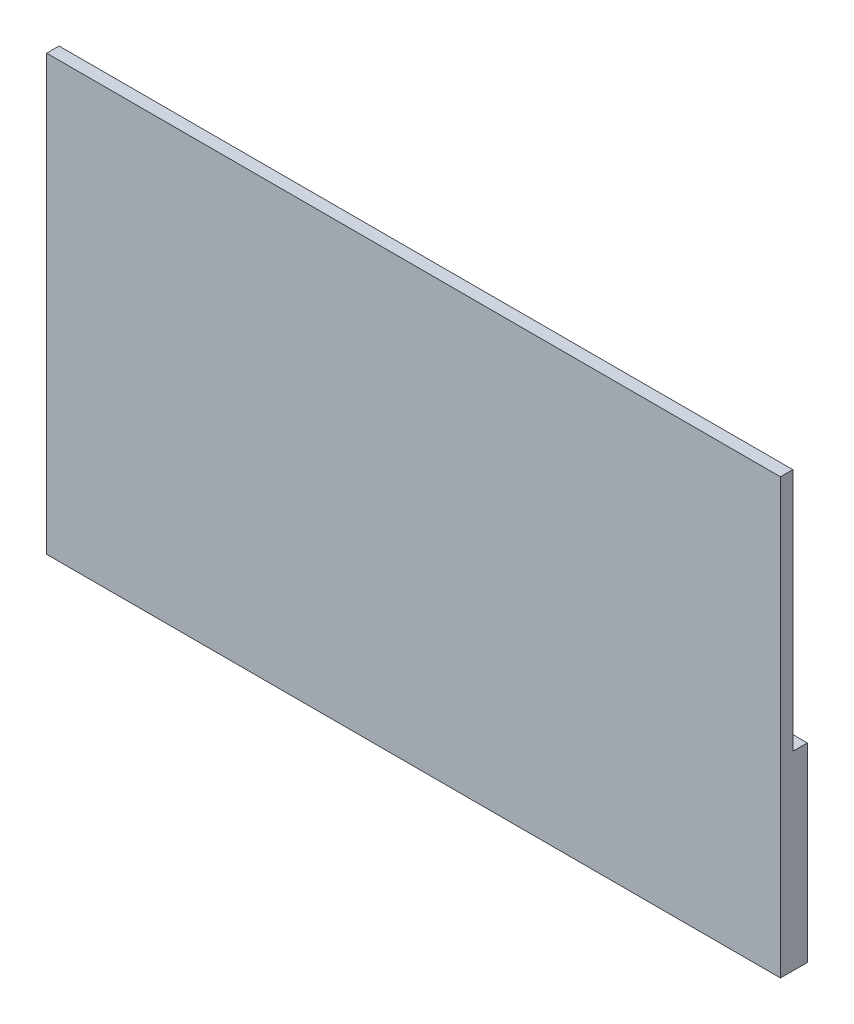
ISO-10303-21;
HEADER;
FILE_DESCRIPTION(('STEP AP214'),'2;1');
FILE_NAME('part.step','',(''),(''),'','','');
FILE_SCHEMA(('AUTOMOTIVE_DESIGN { 1 0 10303 214 1 1 1 1 }'));
ENDSEC;
DATA;
#1=APPLICATION_CONTEXT('core data for automotive mechanical design processes');
#2=APPLICATION_PROTOCOL_DEFINITION('international standard','automotive_design',2000,#1);
#3=PRODUCT_CONTEXT('',#1,'mechanical');
#4=PRODUCT('Part','Part','',(#3));
#5=PRODUCT_RELATED_PRODUCT_CATEGORY('part','',(#4));
#6=PRODUCT_DEFINITION_FORMATION('','',#4);
#7=PRODUCT_DEFINITION_CONTEXT('part definition',#1,'design');
#8=PRODUCT_DEFINITION('design','',#6,#7);
#9=PRODUCT_DEFINITION_SHAPE('','',#8);
#10=(LENGTH_UNIT() NAMED_UNIT(*) SI_UNIT(.MILLI.,.METRE.));
#11=(NAMED_UNIT(*) PLANE_ANGLE_UNIT() SI_UNIT($,.RADIAN.));
#12=(NAMED_UNIT(*) SI_UNIT($,.STERADIAN.) SOLID_ANGLE_UNIT());
#13=UNCERTAINTY_MEASURE_WITH_UNIT(LENGTH_MEASURE(1.E-05),#10,'distance_accuracy_value','');
#14=(GEOMETRIC_REPRESENTATION_CONTEXT(3) GLOBAL_UNCERTAINTY_ASSIGNED_CONTEXT((#13)) GLOBAL_UNIT_ASSIGNED_CONTEXT((#10,
#11,#12)) REPRESENTATION_CONTEXT('',''));
#15=CARTESIAN_POINT('',(0.,0.,0.));
#16=DIRECTION('',(0.,0.,1.));
#17=DIRECTION('',(1.,0.,0.));
#18=AXIS2_PLACEMENT_3D('',#15,#16,#17);
#19=CARTESIAN_POINT('',(0.,0.,0.));
#20=DIRECTION('',(0.,0.,-1.));
#21=DIRECTION('',(-1.,0.,0.));
#22=AXIS2_PLACEMENT_3D('',#19,#20,#21);
#23=PLANE('',#22);
#24=DIRECTION('',(0.,1.,0.));
#25=VECTOR('',#24,1.);
#26=CARTESIAN_POINT('',(177.5,-105.,0.));
#27=LINE('',#26,#25);
#28=CARTESIAN_POINT('',(177.5,-13.,0.));
#29=VERTEX_POINT('',#28);
#30=CARTESIAN_POINT('',(177.5,105.,0.));
#31=VERTEX_POINT('',#30);
#32=EDGE_CURVE('E149',#29,#31,#27,.T.);
#33=ORIENTED_EDGE('',*,*,#32,.F.);
#34=DIRECTION('',(-1.,0.,0.));
#35=VECTOR('',#34,1.);
#36=CARTESIAN_POINT('',(-177.5,-13.,0.));
#37=LINE('',#36,#35);
#38=CARTESIAN_POINT('',(-177.5,-13.,0.));
#39=VERTEX_POINT('',#38);
#40=EDGE_CURVE('E134',#29,#39,#37,.T.);
#41=ORIENTED_EDGE('',*,*,#40,.T.);
#42=DIRECTION('',(0.,-1.,0.));
#43=VECTOR('',#42,1.);
#44=CARTESIAN_POINT('',(-177.5,-105.,0.));
#45=LINE('',#44,#43);
#46=CARTESIAN_POINT('',(-177.5,105.,0.));
#47=VERTEX_POINT('',#46);
#48=EDGE_CURVE('E153',#47,#39,#45,.T.);
#49=ORIENTED_EDGE('',*,*,#48,.F.);
#50=DIRECTION('',(-1.,0.,0.));
#51=VECTOR('',#50,1.);
#52=CARTESIAN_POINT('',(-177.5,105.,0.));
#53=LINE('',#52,#51);
#54=EDGE_CURVE('E82',#31,#47,#53,.T.);
#55=ORIENTED_EDGE('',*,*,#54,.F.);
#56=EDGE_LOOP('',(#33,#41,#49,#55));
#57=FACE_BOUND('',#56,.T.);
#58=ADVANCED_FACE('F43',(#57),#23,.T.);
#59=CARTESIAN_POINT('',(177.5,-105.,6.));
#60=DIRECTION('',(-1.,0.,0.));
#61=DIRECTION('',(0.,0.,1.));
#62=AXIS2_PLACEMENT_3D('',#59,#60,#61);
#63=PLANE('',#62);
#64=DIRECTION('',(0.,0.,-1.));
#65=VECTOR('',#64,1.);
#66=CARTESIAN_POINT('',(177.5,-105.,6.));
#67=LINE('',#66,#65);
#68=CARTESIAN_POINT('',(177.5,-105.,6.));
#69=VERTEX_POINT('',#68);
#70=CARTESIAN_POINT('',(177.5,-105.,-7.));
#71=VERTEX_POINT('',#70);
#72=EDGE_CURVE('E158',#69,#71,#67,.T.);
#73=ORIENTED_EDGE('',*,*,#72,.T.);
#74=DIRECTION('',(0.,1.,0.));
#75=VECTOR('',#74,1.);
#76=CARTESIAN_POINT('',(177.5,-105.,-7.));
#77=LINE('',#76,#75);
#78=CARTESIAN_POINT('',(177.5,-13.,-7.));
#79=VERTEX_POINT('',#78);
#80=EDGE_CURVE('E141',#71,#79,#77,.T.);
#81=ORIENTED_EDGE('',*,*,#80,.T.);
#82=DIRECTION('',(0.,0.,1.));
#83=VECTOR('',#82,1.);
#84=CARTESIAN_POINT('',(177.5,-13.,-7.));
#85=LINE('',#84,#83);
#86=EDGE_CURVE('E146',#79,#29,#85,.T.);
#87=ORIENTED_EDGE('',*,*,#86,.T.);
#88=ORIENTED_EDGE('',*,*,#32,.T.);
#89=DIRECTION('',(0.,0.,-1.));
#90=VECTOR('',#89,1.);
#91=CARTESIAN_POINT('',(177.5,105.,6.));
#92=LINE('',#91,#90);
#93=CARTESIAN_POINT('',(177.5,105.,6.));
#94=VERTEX_POINT('',#93);
#95=EDGE_CURVE('E11',#94,#31,#92,.T.);
#96=ORIENTED_EDGE('',*,*,#95,.F.);
#97=DIRECTION('',(0.,1.,0.));
#98=VECTOR('',#97,1.);
#99=CARTESIAN_POINT('',(177.5,-105.,6.));
#100=LINE('',#99,#98);
#101=EDGE_CURVE('E151',#69,#94,#100,.T.);
#102=ORIENTED_EDGE('',*,*,#101,.F.);
#103=EDGE_LOOP('',(#73,#81,#87,#88,#96,#102));
#104=FACE_BOUND('',#103,.T.);
#105=ADVANCED_FACE('F45',(#104),#63,.F.);
#106=CARTESIAN_POINT('',(-177.5,105.,6.));
#107=DIRECTION('',(0.,-1.,0.));
#108=DIRECTION('',(0.,0.,-1.));
#109=AXIS2_PLACEMENT_3D('',#106,#107,#108);
#110=PLANE('',#109);
#111=ORIENTED_EDGE('',*,*,#54,.T.);
#112=DIRECTION('',(0.,0.,-1.));
#113=VECTOR('',#112,1.);
#114=CARTESIAN_POINT('',(-177.5,105.,6.));
#115=LINE('',#114,#113);
#116=CARTESIAN_POINT('',(-177.5,105.,6.));
#117=VERTEX_POINT('',#116);
#118=EDGE_CURVE('E51',#117,#47,#115,.T.);
#119=ORIENTED_EDGE('',*,*,#118,.F.);
#120=DIRECTION('',(-1.,0.,0.));
#121=VECTOR('',#120,1.);
#122=CARTESIAN_POINT('',(-177.5,105.,6.));
#123=LINE('',#122,#121);
#124=EDGE_CURVE('E87',#94,#117,#123,.T.);
#125=ORIENTED_EDGE('',*,*,#124,.F.);
#126=ORIENTED_EDGE('',*,*,#95,.T.);
#127=EDGE_LOOP('',(#111,#119,#125,#126));
#128=FACE_BOUND('',#127,.T.);
#129=ADVANCED_FACE('F199',(#128),#110,.F.);
#130=CARTESIAN_POINT('',(-177.5,-105.,6.));
#131=DIRECTION('',(1.,0.,0.));
#132=DIRECTION('',(0.,0.,-1.));
#133=AXIS2_PLACEMENT_3D('',#130,#131,#132);
#134=PLANE('',#133);
#135=ORIENTED_EDGE('',*,*,#48,.T.);
#136=DIRECTION('',(0.,0.,1.));
#137=VECTOR('',#136,1.);
#138=CARTESIAN_POINT('',(-177.5,-13.,-7.));
#139=LINE('',#138,#137);
#140=CARTESIAN_POINT('',(-177.5,-13.,-7.));
#141=VERTEX_POINT('',#140);
#142=EDGE_CURVE('E58',#141,#39,#139,.T.);
#143=ORIENTED_EDGE('',*,*,#142,.F.);
#144=DIRECTION('',(0.,-1.,0.));
#145=VECTOR('',#144,1.);
#146=CARTESIAN_POINT('',(-177.5,-105.,-7.));
#147=LINE('',#146,#145);
#148=CARTESIAN_POINT('',(-177.5,-105.,-7.));
#149=VERTEX_POINT('',#148);
#150=EDGE_CURVE('E135',#141,#149,#147,.T.);
#151=ORIENTED_EDGE('',*,*,#150,.T.);
#152=DIRECTION('',(0.,0.,-1.));
#153=VECTOR('',#152,1.);
#154=CARTESIAN_POINT('',(-177.5,-105.,6.));
#155=LINE('',#154,#153);
#156=CARTESIAN_POINT('',(-177.5,-105.,6.));
#157=VERTEX_POINT('',#156);
#158=EDGE_CURVE('E164',#157,#149,#155,.T.);
#159=ORIENTED_EDGE('',*,*,#158,.F.);
#160=DIRECTION('',(0.,-1.,0.));
#161=VECTOR('',#160,1.);
#162=CARTESIAN_POINT('',(-177.5,-105.,6.));
#163=LINE('',#162,#161);
#164=EDGE_CURVE('E155',#117,#157,#163,.T.);
#165=ORIENTED_EDGE('',*,*,#164,.F.);
#166=ORIENTED_EDGE('',*,*,#118,.T.);
#167=EDGE_LOOP('',(#135,#143,#151,#159,#165,#166));
#168=FACE_BOUND('',#167,.T.);
#169=ADVANCED_FACE('F168',(#168),#134,.F.);
#170=CARTESIAN_POINT('',(-177.5,-105.,6.));
#171=DIRECTION('',(0.,1.,0.));
#172=DIRECTION('',(0.,0.,1.));
#173=AXIS2_PLACEMENT_3D('',#170,#171,#172);
#174=PLANE('',#173);
#175=ORIENTED_EDGE('',*,*,#158,.T.);
#176=DIRECTION('',(1.,0.,0.));
#177=VECTOR('',#176,1.);
#178=CARTESIAN_POINT('',(-177.5,-105.,-7.));
#179=LINE('',#178,#177);
#180=EDGE_CURVE('E138',#149,#71,#179,.T.);
#181=ORIENTED_EDGE('',*,*,#180,.T.);
#182=ORIENTED_EDGE('',*,*,#72,.F.);
#183=DIRECTION('',(1.,0.,0.));
#184=VECTOR('',#183,1.);
#185=CARTESIAN_POINT('',(-177.5,-105.,6.));
#186=LINE('',#185,#184);
#187=EDGE_CURVE('E67',#157,#69,#186,.T.);
#188=ORIENTED_EDGE('',*,*,#187,.F.);
#189=EDGE_LOOP('',(#175,#181,#182,#188));
#190=FACE_BOUND('',#189,.T.);
#191=ADVANCED_FACE('F182',(#190),#174,.F.);
#192=CARTESIAN_POINT('',(0.,0.,6.));
#193=DIRECTION('',(0.,0.,-1.));
#194=DIRECTION('',(-1.,0.,0.));
#195=AXIS2_PLACEMENT_3D('',#192,#193,#194);
#196=PLANE('',#195);
#197=ORIENTED_EDGE('',*,*,#101,.T.);
#198=ORIENTED_EDGE('',*,*,#124,.T.);
#199=ORIENTED_EDGE('',*,*,#164,.T.);
#200=ORIENTED_EDGE('',*,*,#187,.T.);
#201=EDGE_LOOP('',(#197,#198,#199,#200));
#202=FACE_BOUND('',#201,.T.);
#203=ADVANCED_FACE('F184',(#202),#196,.F.);
#204=CARTESIAN_POINT('',(-177.5,-13.,-7.));
#205=DIRECTION('',(0.,1.,0.));
#206=DIRECTION('',(0.,0.,1.));
#207=AXIS2_PLACEMENT_3D('',#204,#205,#206);
#208=PLANE('',#207);
#209=ORIENTED_EDGE('',*,*,#40,.F.);
#210=ORIENTED_EDGE('',*,*,#86,.F.);
#211=DIRECTION('',(-1.,0.,0.));
#212=VECTOR('',#211,1.);
#213=CARTESIAN_POINT('',(-177.5,-13.,-7.));
#214=LINE('',#213,#212);
#215=EDGE_CURVE('E144',#79,#141,#214,.T.);
#216=ORIENTED_EDGE('',*,*,#215,.T.);
#217=ORIENTED_EDGE('',*,*,#142,.T.);
#218=EDGE_LOOP('',(#209,#210,#216,#217));
#219=FACE_BOUND('',#218,.T.);
#220=ADVANCED_FACE('F172',(#219),#208,.T.);
#221=CARTESIAN_POINT('',(0.,0.,-7.));
#222=DIRECTION('',(0.,0.,-1.));
#223=DIRECTION('',(-1.,0.,0.));
#224=AXIS2_PLACEMENT_3D('',#221,#222,#223);
#225=PLANE('',#224);
#226=CARTESIAN_POINT('',(37.5,-29.,-7.));
#227=DIRECTION('',(0.,0.,-1.));
#228=DIRECTION('',(-1.,0.,0.));
#229=AXIS2_PLACEMENT_3D('',#226,#227,#228);
#230=CIRCLE('',#229,2.025);
#231=CARTESIAN_POINT('',(35.475,-29.,-7.));
#232=VERTEX_POINT('',#231);
#233=EDGE_CURVE('E125',#232,#232,#230,.T.);
#234=ORIENTED_EDGE('',*,*,#233,.F.);
#235=EDGE_LOOP('',(#234));
#236=FACE_BOUND('',#235,.T.);
#237=CARTESIAN_POINT('',(-37.5,-29.,-7.));
#238=DIRECTION('',(0.,0.,-1.));
#239=DIRECTION('',(-1.,0.,0.));
#240=AXIS2_PLACEMENT_3D('',#237,#238,#239);
#241=CIRCLE('',#240,2.025);
#242=CARTESIAN_POINT('',(-39.525,-29.,-7.));
#243=VERTEX_POINT('',#242);
#244=EDGE_CURVE('E118',#243,#243,#241,.T.);
#245=ORIENTED_EDGE('',*,*,#244,.F.);
#246=EDGE_LOOP('',(#245));
#247=FACE_BOUND('',#246,.T.);
#248=ORIENTED_EDGE('',*,*,#150,.F.);
#249=ORIENTED_EDGE('',*,*,#215,.F.);
#250=ORIENTED_EDGE('',*,*,#80,.F.);
#251=ORIENTED_EDGE('',*,*,#180,.F.);
#252=EDGE_LOOP('',(#248,#249,#250,#251));
#253=FACE_BOUND('',#252,.T.);
#254=ADVANCED_FACE('F180',(#236,#247,#253),#225,.T.);
#255=CARTESIAN_POINT('',(-37.5,-29.,-4.99142002139548));
#256=DIRECTION('',(0.,0.,-1.));
#257=DIRECTION('',(-1.,0.,0.));
#258=AXIS2_PLACEMENT_3D('',#255,#256,#257);
#259=CONICAL_SURFACE('',#258,1.65,1.02974425867665);
#260=CARTESIAN_POINT('',(-37.5,-29.,-4.));
#261=VERTEX_POINT('',#260);
#262=VERTEX_LOOP('',#261);
#263=FACE_BOUND('',#262,.T.);
#264=CARTESIAN_POINT('',(-37.5,-29.,-4.99142002139548));
#265=DIRECTION('',(0.,0.,-1.));
#266=DIRECTION('',(-1.,0.,0.));
#267=AXIS2_PLACEMENT_3D('',#264,#265,#266);
#268=CIRCLE('',#267,1.65);
#269=CARTESIAN_POINT('',(-39.15,-29.,-4.99142002139548));
#270=VERTEX_POINT('',#269);
#271=EDGE_CURVE('E131',#270,#270,#268,.T.);
#272=ORIENTED_EDGE('',*,*,#271,.T.);
#273=EDGE_LOOP('',(#272));
#274=FACE_BOUND('',#273,.T.);
#275=ADVANCED_FACE('F253',(#263,#274),#259,.F.);
#276=CARTESIAN_POINT('',(-37.5,-29.,-7.));
#277=DIRECTION('',(0.,0.,-1.));
#278=DIRECTION('',(-1.,0.,0.));
#279=AXIS2_PLACEMENT_3D('',#276,#277,#278);
#280=CYLINDRICAL_SURFACE('',#279,1.65);
#281=ORIENTED_EDGE('',*,*,#271,.F.);
#282=EDGE_LOOP('',(#281));
#283=FACE_BOUND('',#282,.T.);
#284=CARTESIAN_POINT('',(-37.5,-29.,-6.625));
#285=DIRECTION('',(0.,0.,-1.));
#286=DIRECTION('',(-1.,0.,0.));
#287=AXIS2_PLACEMENT_3D('',#284,#285,#286);
#288=CIRCLE('',#287,1.65);
#289=CARTESIAN_POINT('',(-39.15,-29.,-6.625));
#290=VERTEX_POINT('',#289);
#291=EDGE_CURVE('E122',#290,#290,#288,.T.);
#292=ORIENTED_EDGE('',*,*,#291,.T.);
#293=EDGE_LOOP('',(#292));
#294=FACE_BOUND('',#293,.T.);
#295=ADVANCED_FACE('F265',(#283,#294),#280,.F.);
#296=CARTESIAN_POINT('',(-37.5,-29.,-7.));
#297=DIRECTION('',(0.,0.,-1.));
#298=DIRECTION('',(-1.,0.,0.));
#299=AXIS2_PLACEMENT_3D('',#296,#297,#298);
#300=CONICAL_SURFACE('',#299,2.025,0.785398163397446);
#301=ORIENTED_EDGE('',*,*,#291,.F.);
#302=EDGE_LOOP('',(#301));
#303=FACE_BOUND('',#302,.T.);
#304=ORIENTED_EDGE('',*,*,#244,.T.);
#305=EDGE_LOOP('',(#304));
#306=FACE_BOUND('',#305,.T.);
#307=ADVANCED_FACE('F112',(#303,#306),#300,.F.);
#308=CARTESIAN_POINT('',(37.5,-29.,-4.99142002139548));
#309=DIRECTION('',(0.,0.,-1.));
#310=DIRECTION('',(-1.,0.,0.));
#311=AXIS2_PLACEMENT_3D('',#308,#309,#310);
#312=CONICAL_SURFACE('',#311,1.65,1.02974425867665);
#313=CARTESIAN_POINT('',(37.5,-29.,-4.));
#314=VERTEX_POINT('',#313);
#315=VERTEX_LOOP('',#314);
#316=FACE_BOUND('',#315,.T.);
#317=CARTESIAN_POINT('',(37.5,-29.,-4.99142002139548));
#318=DIRECTION('',(0.,0.,-1.));
#319=DIRECTION('',(-1.,0.,0.));
#320=AXIS2_PLACEMENT_3D('',#317,#318,#319);
#321=CIRCLE('',#320,1.65);
#322=CARTESIAN_POINT('',(35.85,-29.,-4.99142002139548));
#323=VERTEX_POINT('',#322);
#324=EDGE_CURVE('E116',#323,#323,#321,.T.);
#325=ORIENTED_EDGE('',*,*,#324,.T.);
#326=EDGE_LOOP('',(#325));
#327=FACE_BOUND('',#326,.T.);
#328=ADVANCED_FACE('F108',(#316,#327),#312,.F.);
#329=CARTESIAN_POINT('',(37.5,-29.,-7.));
#330=DIRECTION('',(0.,0.,-1.));
#331=DIRECTION('',(-1.,0.,0.));
#332=AXIS2_PLACEMENT_3D('',#329,#330,#331);
#333=CYLINDRICAL_SURFACE('',#332,1.65);
#334=ORIENTED_EDGE('',*,*,#324,.F.);
#335=EDGE_LOOP('',(#334));
#336=FACE_BOUND('',#335,.T.);
#337=CARTESIAN_POINT('',(37.5,-29.,-6.625));
#338=DIRECTION('',(0.,0.,-1.));
#339=DIRECTION('',(-1.,0.,0.));
#340=AXIS2_PLACEMENT_3D('',#337,#338,#339);
#341=CIRCLE('',#340,1.65);
#342=CARTESIAN_POINT('',(35.85,-29.,-6.625));
#343=VERTEX_POINT('',#342);
#344=EDGE_CURVE('E119',#343,#343,#341,.T.);
#345=ORIENTED_EDGE('',*,*,#344,.T.);
#346=EDGE_LOOP('',(#345));
#347=FACE_BOUND('',#346,.T.);
#348=ADVANCED_FACE('F111',(#336,#347),#333,.F.);
#349=CARTESIAN_POINT('',(37.5,-29.,-7.));
#350=DIRECTION('',(0.,0.,-1.));
#351=DIRECTION('',(-1.,0.,0.));
#352=AXIS2_PLACEMENT_3D('',#349,#350,#351);
#353=CONICAL_SURFACE('',#352,2.025,0.785398163397446);
#354=ORIENTED_EDGE('',*,*,#344,.F.);
#355=EDGE_LOOP('',(#354));
#356=FACE_BOUND('',#355,.T.);
#357=ORIENTED_EDGE('',*,*,#233,.T.);
#358=EDGE_LOOP('',(#357));
#359=FACE_BOUND('',#358,.T.);
#360=ADVANCED_FACE('F300',(#356,#359),#353,.F.);
#361=CLOSED_SHELL('',(#58,#105,#129,#169,#191,#203,#220,#254,#275,#295,#307,#328,#348,#360));
#362=MANIFOLD_SOLID_BREP('B2',#361);
#363=ADVANCED_BREP_SHAPE_REPRESENTATION('',(#18,#362),#14);
#364=SHAPE_DEFINITION_REPRESENTATION(#9,#363);
ENDSEC;
END-ISO-10303-21;
